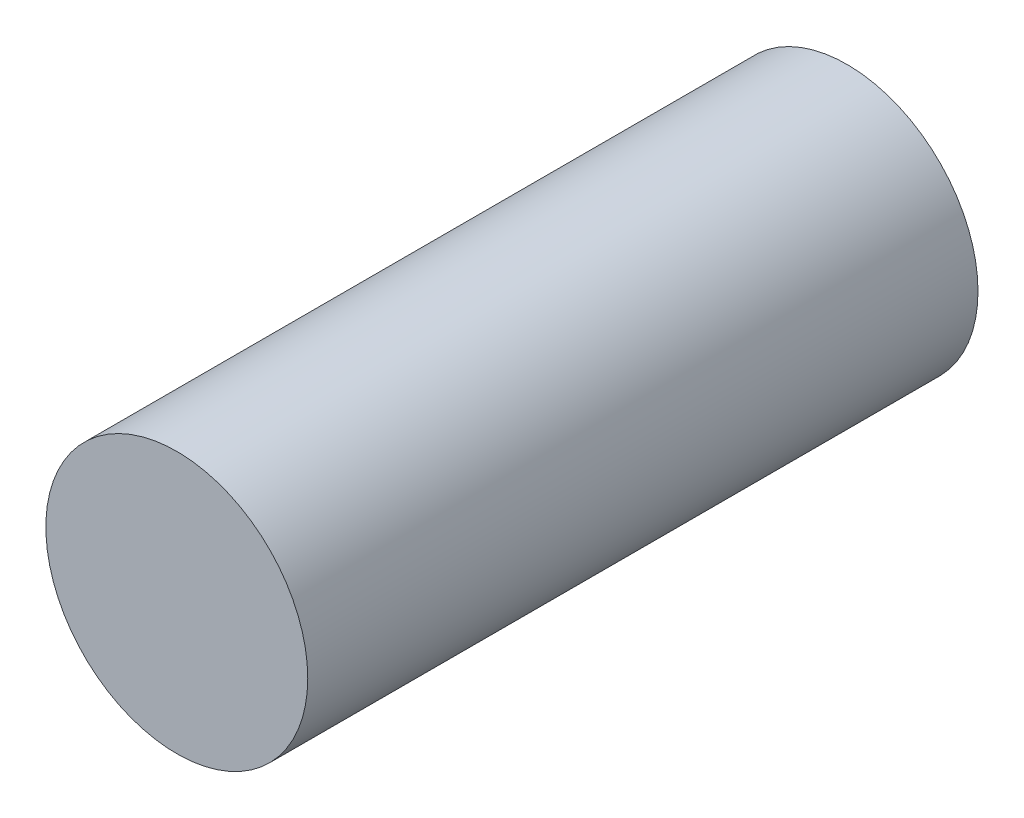
ISO-10303-21;
HEADER;
FILE_DESCRIPTION(('STEP AP214'),'2;1');
FILE_NAME('part.step','',(''),(''),'','','');
FILE_SCHEMA(('AUTOMOTIVE_DESIGN { 1 0 10303 214 1 1 1 1 }'));
ENDSEC;
DATA;
#1=APPLICATION_CONTEXT('core data for automotive mechanical design processes');
#2=APPLICATION_PROTOCOL_DEFINITION('international standard','automotive_design',2000,#1);
#3=PRODUCT_CONTEXT('',#1,'mechanical');
#4=PRODUCT('Part','Part','',(#3));
#5=PRODUCT_RELATED_PRODUCT_CATEGORY('part','',(#4));
#6=PRODUCT_DEFINITION_FORMATION('','',#4);
#7=PRODUCT_DEFINITION_CONTEXT('part definition',#1,'design');
#8=PRODUCT_DEFINITION('design','',#6,#7);
#9=PRODUCT_DEFINITION_SHAPE('','',#8);
#10=(LENGTH_UNIT() NAMED_UNIT(*) SI_UNIT(.MILLI.,.METRE.));
#11=(NAMED_UNIT(*) PLANE_ANGLE_UNIT() SI_UNIT($,.RADIAN.));
#12=(NAMED_UNIT(*) SI_UNIT($,.STERADIAN.) SOLID_ANGLE_UNIT());
#13=UNCERTAINTY_MEASURE_WITH_UNIT(LENGTH_MEASURE(1.E-05),#10,'distance_accuracy_value','');
#14=(GEOMETRIC_REPRESENTATION_CONTEXT(3) GLOBAL_UNCERTAINTY_ASSIGNED_CONTEXT((#13)) GLOBAL_UNIT_ASSIGNED_CONTEXT((#10,
#11,#12)) REPRESENTATION_CONTEXT('',''));
#15=CARTESIAN_POINT('',(0.,0.,0.));
#16=DIRECTION('',(0.,0.,1.));
#17=DIRECTION('',(1.,0.,0.));
#18=AXIS2_PLACEMENT_3D('',#15,#16,#17);
#19=CARTESIAN_POINT('',(0.,0.,65.));
#20=DIRECTION('',(0.,0.,-1.));
#21=DIRECTION('',(-0.999999999999996,0.,0.));
#22=AXIS2_PLACEMENT_3D('',#19,#20,#21);
#23=CYLINDRICAL_SURFACE('',#22,12.7);
#24=CARTESIAN_POINT('',(0.,0.,65.));
#25=DIRECTION('',(0.,0.,1.));
#26=DIRECTION('',(0.999999999999996,0.,0.));
#27=AXIS2_PLACEMENT_3D('',#24,#25,#26);
#28=CIRCLE('',#27,12.7);
#29=CARTESIAN_POINT('',(12.6999999999999,0.,65.));
#30=VERTEX_POINT('',#29);
#31=EDGE_CURVE('E10',#30,#30,#28,.T.);
#32=ORIENTED_EDGE('',*,*,#31,.F.);
#33=EDGE_LOOP('',(#32));
#34=FACE_BOUND('',#33,.T.);
#35=CARTESIAN_POINT('',(0.,0.,0.));
#36=DIRECTION('',(0.,0.,1.));
#37=DIRECTION('',(0.999999999999996,0.,0.));
#38=AXIS2_PLACEMENT_3D('',#35,#36,#37);
#39=CIRCLE('',#38,12.7);
#40=CARTESIAN_POINT('',(12.6999999999999,0.,0.));
#41=VERTEX_POINT('',#40);
#42=EDGE_CURVE('E31',#41,#41,#39,.T.);
#43=ORIENTED_EDGE('',*,*,#42,.T.);
#44=EDGE_LOOP('',(#43));
#45=FACE_BOUND('',#44,.T.);
#46=ADVANCED_FACE('F28',(#34,#45),#23,.T.);
#47=CARTESIAN_POINT('',(0.,0.,65.));
#48=DIRECTION('',(0.,0.,1.));
#49=DIRECTION('',(0.999999999999996,0.,0.));
#50=AXIS2_PLACEMENT_3D('',#47,#48,#49);
#51=PLANE('',#50);
#52=ORIENTED_EDGE('',*,*,#31,.T.);
#53=EDGE_LOOP('',(#52));
#54=FACE_BOUND('',#53,.T.);
#55=ADVANCED_FACE('F43',(#54),#51,.T.);
#56=CARTESIAN_POINT('',(0.,0.,0.));
#57=DIRECTION('',(0.,0.,1.));
#58=DIRECTION('',(0.999999999999996,0.,0.));
#59=AXIS2_PLACEMENT_3D('',#56,#57,#58);
#60=PLANE('',#59);
#61=ORIENTED_EDGE('',*,*,#42,.F.);
#62=EDGE_LOOP('',(#61));
#63=FACE_BOUND('',#62,.T.);
#64=ADVANCED_FACE('F41',(#63),#60,.F.);
#65=CLOSED_SHELL('',(#46,#55,#64));
#66=MANIFOLD_SOLID_BREP('B2',#65);
#67=ADVANCED_BREP_SHAPE_REPRESENTATION('',(#18,#66),#14);
#68=SHAPE_DEFINITION_REPRESENTATION(#9,#67);
ENDSEC;
END-ISO-10303-21;
